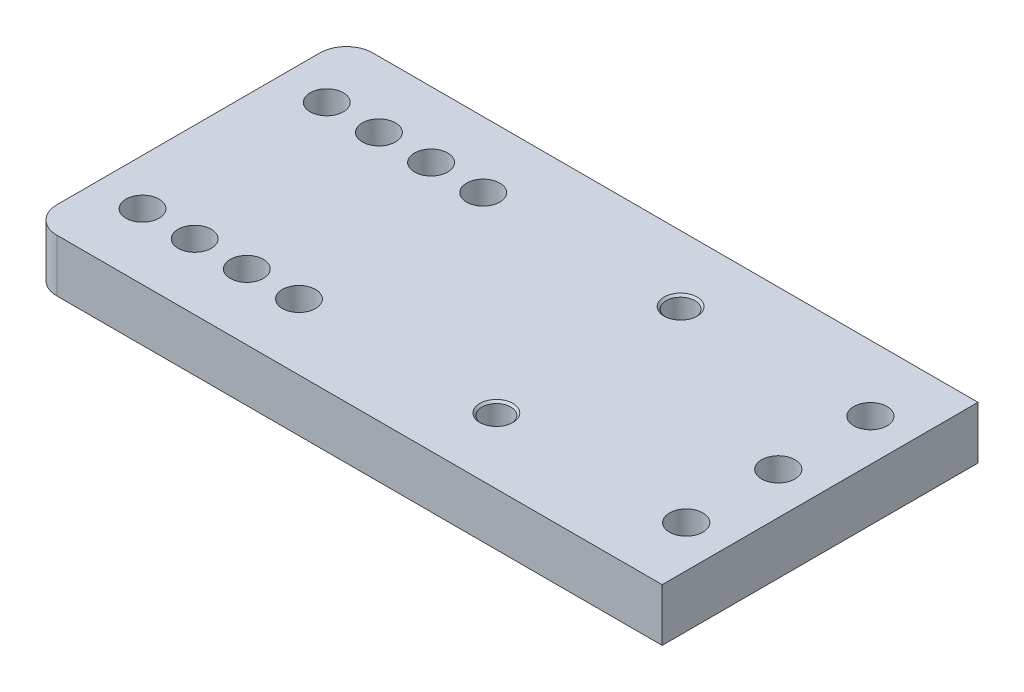
ISO-10303-21;
HEADER;
FILE_DESCRIPTION(('STEP AP214'),'2;1');
FILE_NAME('part.step','',(''),(''),'','','');
FILE_SCHEMA(('AUTOMOTIVE_DESIGN { 1 0 10303 214 1 1 1 1 }'));
ENDSEC;
DATA;
#1=APPLICATION_CONTEXT('core data for automotive mechanical design processes');
#2=APPLICATION_PROTOCOL_DEFINITION('international standard','automotive_design',2000,#1);
#3=PRODUCT_CONTEXT('',#1,'mechanical');
#4=PRODUCT('Part','Part','',(#3));
#5=PRODUCT_RELATED_PRODUCT_CATEGORY('part','',(#4));
#6=PRODUCT_DEFINITION_FORMATION('','',#4);
#7=PRODUCT_DEFINITION_CONTEXT('part definition',#1,'design');
#8=PRODUCT_DEFINITION('design','',#6,#7);
#9=PRODUCT_DEFINITION_SHAPE('','',#8);
#10=(LENGTH_UNIT() NAMED_UNIT(*) SI_UNIT(.MILLI.,.METRE.));
#11=(NAMED_UNIT(*) PLANE_ANGLE_UNIT() SI_UNIT($,.RADIAN.));
#12=(NAMED_UNIT(*) SI_UNIT($,.STERADIAN.) SOLID_ANGLE_UNIT());
#13=UNCERTAINTY_MEASURE_WITH_UNIT(LENGTH_MEASURE(1.E-05),#10,'distance_accuracy_value','');
#14=(GEOMETRIC_REPRESENTATION_CONTEXT(3) GLOBAL_UNCERTAINTY_ASSIGNED_CONTEXT((#13)) GLOBAL_UNIT_ASSIGNED_CONTEXT((#10,
#11,#12)) REPRESENTATION_CONTEXT('',''));
#15=CARTESIAN_POINT('',(0.,0.,0.));
#16=DIRECTION('',(0.,0.,1.));
#17=DIRECTION('',(1.,0.,0.));
#18=AXIS2_PLACEMENT_3D('',#15,#16,#17);
#19=CARTESIAN_POINT('',(150.,0.,60.));
#20=DIRECTION('',(0.,0.,-1.));
#21=DIRECTION('',(-1.,0.,0.));
#22=AXIS2_PLACEMENT_3D('',#19,#20,#21);
#23=PLANE('',#22);
#24=DIRECTION('',(0.,-1.,0.));
#25=VECTOR('',#24,1.);
#26=CARTESIAN_POINT('',(120.,0.,60.));
#27=LINE('',#26,#25);
#28=CARTESIAN_POINT('',(120.,10.,60.));
#29=VERTEX_POINT('',#28);
#30=CARTESIAN_POINT('',(120.,0.,60.));
#31=VERTEX_POINT('',#30);
#32=EDGE_CURVE('E278',#29,#31,#27,.T.);
#33=ORIENTED_EDGE('',*,*,#32,.F.);
#34=DIRECTION('',(-1.,0.,0.));
#35=VECTOR('',#34,1.);
#36=CARTESIAN_POINT('',(150.,10.,60.));
#37=LINE('',#36,#35);
#38=CARTESIAN_POINT('',(5.,10.,60.));
#39=VERTEX_POINT('',#38);
#40=EDGE_CURVE('E110',#39,#29,#37,.F.);
#41=ORIENTED_EDGE('',*,*,#40,.F.);
#42=DIRECTION('',(0.,1.,0.));
#43=VECTOR('',#42,1.);
#44=CARTESIAN_POINT('',(5.,0.,60.));
#45=LINE('',#44,#43);
#46=CARTESIAN_POINT('',(5.,0.,60.));
#47=VERTEX_POINT('',#46);
#48=EDGE_CURVE('E174',#47,#39,#45,.T.);
#49=ORIENTED_EDGE('',*,*,#48,.F.);
#50=DIRECTION('',(-1.,0.,0.));
#51=VECTOR('',#50,1.);
#52=CARTESIAN_POINT('',(150.,0.,60.));
#53=LINE('',#52,#51);
#54=EDGE_CURVE('E113',#31,#47,#53,.T.);
#55=ORIENTED_EDGE('',*,*,#54,.F.);
#56=EDGE_LOOP('',(#33,#41,#49,#55));
#57=FACE_BOUND('',#56,.T.);
#58=ADVANCED_FACE('F41',(#57),#23,.F.);
#59=CARTESIAN_POINT('',(150.,0.,0.));
#60=DIRECTION('',(0.,0.,-1.));
#61=DIRECTION('',(-1.,0.,0.));
#62=AXIS2_PLACEMENT_3D('',#59,#60,#61);
#63=PLANE('',#62);
#64=DIRECTION('',(-1.,0.,0.));
#65=VECTOR('',#64,1.);
#66=CARTESIAN_POINT('',(150.,10.,0.));
#67=LINE('',#66,#65);
#68=CARTESIAN_POINT('',(5.,10.,0.));
#69=VERTEX_POINT('',#68);
#70=CARTESIAN_POINT('',(120.,10.,0.));
#71=VERTEX_POINT('',#70);
#72=EDGE_CURVE('E50',#69,#71,#67,.F.);
#73=ORIENTED_EDGE('',*,*,#72,.T.);
#74=DIRECTION('',(0.,-1.,0.));
#75=VECTOR('',#74,1.);
#76=CARTESIAN_POINT('',(120.,0.,0.));
#77=LINE('',#76,#75);
#78=CARTESIAN_POINT('',(120.,0.,0.));
#79=VERTEX_POINT('',#78);
#80=EDGE_CURVE('E12',#71,#79,#77,.T.);
#81=ORIENTED_EDGE('',*,*,#80,.T.);
#82=DIRECTION('',(-1.,0.,0.));
#83=VECTOR('',#82,1.);
#84=CARTESIAN_POINT('',(150.,0.,0.));
#85=LINE('',#84,#83);
#86=CARTESIAN_POINT('',(5.,0.,0.));
#87=VERTEX_POINT('',#86);
#88=EDGE_CURVE('E124',#79,#87,#85,.T.);
#89=ORIENTED_EDGE('',*,*,#88,.T.);
#90=DIRECTION('',(0.,1.,0.));
#91=VECTOR('',#90,1.);
#92=CARTESIAN_POINT('',(5.,0.,0.));
#93=LINE('',#92,#91);
#94=EDGE_CURVE('E58',#87,#69,#93,.T.);
#95=ORIENTED_EDGE('',*,*,#94,.T.);
#96=EDGE_LOOP('',(#73,#81,#89,#95));
#97=FACE_BOUND('',#96,.T.);
#98=ADVANCED_FACE('F102',(#97),#63,.T.);
#99=CARTESIAN_POINT('',(76.,10.,12.5));
#100=DIRECTION('',(0.,-1.,0.));
#101=DIRECTION('',(0.,0.,-1.));
#102=AXIS2_PLACEMENT_3D('',#99,#100,#101);
#103=CYLINDRICAL_SURFACE('',#102,2.75);
#104=CARTESIAN_POINT('',(76.,9.59999999963657,12.5));
#105=DIRECTION('',(0.,1.,0.));
#106=DIRECTION('',(0.,0.,1.));
#107=AXIS2_PLACEMENT_3D('',#104,#105,#106);
#108=CIRCLE('',#107,2.75000000032151);
#109=CARTESIAN_POINT('',(76.,9.59999999963657,15.2500000003215));
#110=VERTEX_POINT('',#109);
#111=EDGE_CURVE('E187',#110,#110,#108,.T.);
#112=ORIENTED_EDGE('',*,*,#111,.T.);
#113=EDGE_LOOP('',(#112));
#114=FACE_BOUND('',#113,.T.);
#115=CARTESIAN_POINT('',(76.,0.400000000411183,12.5));
#116=DIRECTION('',(0.,-1.,0.));
#117=DIRECTION('',(0.,0.,-1.));
#118=AXIS2_PLACEMENT_3D('',#115,#116,#117);
#119=CIRCLE('',#118,2.75000000040109);
#120=CARTESIAN_POINT('',(76.,0.400000000411183,9.74999999959891));
#121=VERTEX_POINT('',#120);
#122=EDGE_CURVE('E200',#121,#121,#119,.T.);
#123=ORIENTED_EDGE('',*,*,#122,.T.);
#124=EDGE_LOOP('',(#123));
#125=FACE_BOUND('',#124,.T.);
#126=ADVANCED_FACE('F43',(#114,#125),#103,.F.);
#127=CARTESIAN_POINT('',(76.,10.,47.5));
#128=DIRECTION('',(0.,-1.,0.));
#129=DIRECTION('',(0.,0.,-1.));
#130=AXIS2_PLACEMENT_3D('',#127,#128,#129);
#131=CYLINDRICAL_SURFACE('',#130,2.75);
#132=CARTESIAN_POINT('',(76.,9.59999999957972,47.5));
#133=DIRECTION('',(0.,1.,0.));
#134=DIRECTION('',(0.,0.,1.));
#135=AXIS2_PLACEMENT_3D('',#132,#133,#134);
#136=CIRCLE('',#135,2.75000000034652);
#137=CARTESIAN_POINT('',(76.,9.59999999957972,50.2500000003465));
#138=VERTEX_POINT('',#137);
#139=EDGE_CURVE('E184',#138,#138,#136,.T.);
#140=ORIENTED_EDGE('',*,*,#139,.T.);
#141=EDGE_LOOP('',(#140));
#142=FACE_BOUND('',#141,.T.);
#143=CARTESIAN_POINT('',(76.,0.400000000411183,47.5));
#144=DIRECTION('',(0.,-1.,0.));
#145=DIRECTION('',(0.,0.,-1.));
#146=AXIS2_PLACEMENT_3D('',#143,#144,#145);
#147=CIRCLE('',#146,2.75000000037608);
#148=CARTESIAN_POINT('',(76.,0.400000000411183,44.7499999996239));
#149=VERTEX_POINT('',#148);
#150=EDGE_CURVE('E192',#149,#149,#147,.T.);
#151=ORIENTED_EDGE('',*,*,#150,.T.);
#152=EDGE_LOOP('',(#151));
#153=FACE_BOUND('',#152,.T.);
#154=ADVANCED_FACE('F220',(#142,#153),#131,.F.);
#155=CARTESIAN_POINT('',(76.,1.13686837721616E-10,12.5));
#156=DIRECTION('',(0.,-1.,0.));
#157=DIRECTION('',(0.,0.,-1.));
#158=AXIS2_PLACEMENT_3D('',#155,#156,#157);
#159=CONICAL_SURFACE('',#158,3.14999999995962,0.785398162544797);
#160=CARTESIAN_POINT('',(76.,5.6843418860808E-11,12.5));
#161=DIRECTION('',(0.,-1.,0.));
#162=DIRECTION('',(0.,0.,-1.));
#163=AXIS2_PLACEMENT_3D('',#160,#161,#162);
#164=CIRCLE('',#163,3.15000000001646);
#165=CARTESIAN_POINT('',(76.,5.6843418860808E-11,9.34999999998354));
#166=VERTEX_POINT('',#165);
#167=EDGE_CURVE('E149',#166,#166,#164,.T.);
#168=ORIENTED_EDGE('',*,*,#167,.T.);
#169=EDGE_LOOP('',(#168));
#170=FACE_BOUND('',#169,.T.);
#171=ORIENTED_EDGE('',*,*,#122,.F.);
#172=EDGE_LOOP('',(#171));
#173=FACE_BOUND('',#172,.T.);
#174=ADVANCED_FACE('F339',(#170,#173),#159,.F.);
#175=CARTESIAN_POINT('',(76.,1.13686837721616E-10,47.5));
#176=DIRECTION('',(0.,-1.,0.));
#177=DIRECTION('',(0.,0.,-1.));
#178=AXIS2_PLACEMENT_3D('',#175,#176,#177);
#179=CONICAL_SURFACE('',#178,3.14999999993461,0.785398162544797);
#180=CARTESIAN_POINT('',(76.,5.6843418860808E-11,47.5));
#181=DIRECTION('',(0.,-1.,0.));
#182=DIRECTION('',(0.,0.,-1.));
#183=AXIS2_PLACEMENT_3D('',#180,#181,#182);
#184=CIRCLE('',#183,3.14999999999145);
#185=CARTESIAN_POINT('',(76.,5.6843418860808E-11,44.3500000000085));
#186=VERTEX_POINT('',#185);
#187=EDGE_CURVE('E145',#186,#186,#184,.T.);
#188=ORIENTED_EDGE('',*,*,#187,.T.);
#189=EDGE_LOOP('',(#188));
#190=FACE_BOUND('',#189,.T.);
#191=ORIENTED_EDGE('',*,*,#150,.F.);
#192=EDGE_LOOP('',(#191));
#193=FACE_BOUND('',#192,.T.);
#194=ADVANCED_FACE('F214',(#190,#193),#179,.F.);
#195=CARTESIAN_POINT('',(76.,9.99999999993406,12.5));
#196=DIRECTION('',(0.,1.,0.));
#197=DIRECTION('',(0.,0.,1.));
#198=AXIS2_PLACEMENT_3D('',#195,#196,#197);
#199=CONICAL_SURFACE('',#198,3.14999999988004,0.785398162473743);
#200=CARTESIAN_POINT('',(76.,9.99999999999091,12.5));
#201=DIRECTION('',(0.,1.,0.));
#202=DIRECTION('',(0.,0.,1.));
#203=AXIS2_PLACEMENT_3D('',#200,#201,#202);
#204=CIRCLE('',#203,3.14999999993688);
#205=CARTESIAN_POINT('',(76.,9.99999999999091,15.6499999999369));
#206=VERTEX_POINT('',#205);
#207=EDGE_CURVE('E142',#206,#206,#204,.F.);
#208=ORIENTED_EDGE('',*,*,#207,.F.);
#209=EDGE_LOOP('',(#208));
#210=FACE_BOUND('',#209,.T.);
#211=ORIENTED_EDGE('',*,*,#111,.F.);
#212=EDGE_LOOP('',(#211));
#213=FACE_BOUND('',#212,.T.);
#214=ADVANCED_FACE('F210',(#210,#213),#199,.F.);
#215=CARTESIAN_POINT('',(76.,9.99999999987722,47.5));
#216=DIRECTION('',(0.,1.,0.));
#217=DIRECTION('',(0.,0.,1.));
#218=AXIS2_PLACEMENT_3D('',#215,#216,#217);
#219=CONICAL_SURFACE('',#218,3.14999999990505,0.785398162473743);
#220=CARTESIAN_POINT('',(76.,9.99999999993406,47.5));
#221=DIRECTION('',(0.,1.,0.));
#222=DIRECTION('',(0.,0.,1.));
#223=AXIS2_PLACEMENT_3D('',#220,#221,#222);
#224=CIRCLE('',#223,3.14999999996189);
#225=CARTESIAN_POINT('',(76.,9.99999999993406,50.6499999999619));
#226=VERTEX_POINT('',#225);
#227=EDGE_CURVE('E121',#226,#226,#224,.F.);
#228=ORIENTED_EDGE('',*,*,#227,.F.);
#229=EDGE_LOOP('',(#228));
#230=FACE_BOUND('',#229,.T.);
#231=ORIENTED_EDGE('',*,*,#139,.F.);
#232=EDGE_LOOP('',(#231));
#233=FACE_BOUND('',#232,.T.);
#234=ADVANCED_FACE('F213',(#230,#233),#219,.F.);
#235=CARTESIAN_POINT('',(0.,0.,0.));
#236=DIRECTION('',(-1.,0.,0.));
#237=DIRECTION('',(0.,0.,1.));
#238=AXIS2_PLACEMENT_3D('',#235,#236,#237);
#239=PLANE('',#238);
#240=DIRECTION('',(0.,0.,1.));
#241=VECTOR('',#240,1.);
#242=CARTESIAN_POINT('',(0.,10.,0.));
#243=LINE('',#242,#241);
#244=CARTESIAN_POINT('',(0.,10.,5.));
#245=VERTEX_POINT('',#244);
#246=CARTESIAN_POINT('',(0.,10.,55.));
#247=VERTEX_POINT('',#246);
#248=EDGE_CURVE('E119',#245,#247,#243,.T.);
#249=ORIENTED_EDGE('',*,*,#248,.F.);
#250=DIRECTION('',(0.,1.,0.));
#251=VECTOR('',#250,1.);
#252=CARTESIAN_POINT('',(0.,0.,5.));
#253=LINE('',#252,#251);
#254=CARTESIAN_POINT('',(0.,0.,5.));
#255=VERTEX_POINT('',#254);
#256=EDGE_CURVE('E140',#255,#245,#253,.T.);
#257=ORIENTED_EDGE('',*,*,#256,.F.);
#258=DIRECTION('',(0.,0.,1.));
#259=VECTOR('',#258,1.);
#260=CARTESIAN_POINT('',(0.,0.,0.));
#261=LINE('',#260,#259);
#262=CARTESIAN_POINT('',(0.,0.,55.));
#263=VERTEX_POINT('',#262);
#264=EDGE_CURVE('E125',#255,#263,#261,.T.);
#265=ORIENTED_EDGE('',*,*,#264,.T.);
#266=DIRECTION('',(0.,-1.,0.));
#267=VECTOR('',#266,1.);
#268=CARTESIAN_POINT('',(0.,0.,55.));
#269=LINE('',#268,#267);
#270=EDGE_CURVE('E83',#247,#263,#269,.T.);
#271=ORIENTED_EDGE('',*,*,#270,.F.);
#272=EDGE_LOOP('',(#249,#257,#265,#271));
#273=FACE_BOUND('',#272,.T.);
#274=ADVANCED_FACE('F365',(#273),#239,.T.);
#275=CARTESIAN_POINT('',(5.,0.,55.));
#276=DIRECTION('',(0.,-1.,0.));
#277=DIRECTION('',(0.,0.,-1.));
#278=AXIS2_PLACEMENT_3D('',#275,#276,#277);
#279=CYLINDRICAL_SURFACE('',#278,5.);
#280=CARTESIAN_POINT('',(5.,10.,55.));
#281=DIRECTION('',(0.,-1.,0.));
#282=DIRECTION('',(0.,0.,-1.));
#283=AXIS2_PLACEMENT_3D('',#280,#281,#282);
#284=CIRCLE('',#283,5.);
#285=EDGE_CURVE('E115',#247,#39,#284,.F.);
#286=ORIENTED_EDGE('',*,*,#285,.F.);
#287=ORIENTED_EDGE('',*,*,#270,.T.);
#288=CARTESIAN_POINT('',(5.,0.,55.));
#289=DIRECTION('',(0.,-1.,0.));
#290=DIRECTION('',(0.,0.,-1.));
#291=AXIS2_PLACEMENT_3D('',#288,#289,#290);
#292=CIRCLE('',#291,5.);
#293=EDGE_CURVE('E141',#263,#47,#292,.F.);
#294=ORIENTED_EDGE('',*,*,#293,.T.);
#295=ORIENTED_EDGE('',*,*,#48,.T.);
#296=EDGE_LOOP('',(#286,#287,#294,#295));
#297=FACE_BOUND('',#296,.T.);
#298=ADVANCED_FACE('F312',(#297),#279,.T.);
#299=CARTESIAN_POINT('',(150.,0.,0.));
#300=DIRECTION('',(0.,1.,0.));
#301=DIRECTION('',(0.,0.,1.));
#302=AXIS2_PLACEMENT_3D('',#299,#300,#301);
#303=PLANE('',#302);
#304=CARTESIAN_POINT('',(112.0625,0.,47.5));
#305=DIRECTION('',(0.,-1.,0.));
#306=DIRECTION('',(0.,0.,-1.));
#307=AXIS2_PLACEMENT_3D('',#304,#305,#306);
#308=CIRCLE('',#307,3.175);
#309=CARTESIAN_POINT('',(112.0625,0.,44.325));
#310=VERTEX_POINT('',#309);
#311=EDGE_CURVE('E293',#310,#310,#308,.T.);
#312=ORIENTED_EDGE('',*,*,#311,.F.);
#313=EDGE_LOOP('',(#312));
#314=FACE_BOUND('',#313,.T.);
#315=CARTESIAN_POINT('',(112.0625,0.,30.));
#316=DIRECTION('',(0.,-1.,0.));
#317=DIRECTION('',(0.,0.,-1.));
#318=AXIS2_PLACEMENT_3D('',#315,#316,#317);
#319=CIRCLE('',#318,3.175);
#320=CARTESIAN_POINT('',(112.0625,0.,26.825));
#321=VERTEX_POINT('',#320);
#322=EDGE_CURVE('E287',#321,#321,#319,.T.);
#323=ORIENTED_EDGE('',*,*,#322,.F.);
#324=EDGE_LOOP('',(#323));
#325=FACE_BOUND('',#324,.T.);
#326=CARTESIAN_POINT('',(112.0625,0.,12.5));
#327=DIRECTION('',(0.,-1.,0.));
#328=DIRECTION('',(0.,0.,-1.));
#329=AXIS2_PLACEMENT_3D('',#326,#327,#328);
#330=CIRCLE('',#329,3.175);
#331=CARTESIAN_POINT('',(112.0625,0.,9.325));
#332=VERTEX_POINT('',#331);
#333=EDGE_CURVE('E281',#332,#332,#330,.T.);
#334=ORIENTED_EDGE('',*,*,#333,.F.);
#335=EDGE_LOOP('',(#334));
#336=FACE_BOUND('',#335,.T.);
#337=CARTESIAN_POINT('',(38.5,0.,47.4999999999997));
#338=DIRECTION('',(0.,-1.,0.));
#339=DIRECTION('',(0.,0.,-1.));
#340=AXIS2_PLACEMENT_3D('',#337,#338,#339);
#341=CIRCLE('',#340,3.14999999999145);
#342=CARTESIAN_POINT('',(38.5,0.,44.3500000000083));
#343=VERTEX_POINT('',#342);
#344=EDGE_CURVE('E264',#343,#343,#341,.T.);
#345=ORIENTED_EDGE('',*,*,#344,.F.);
#346=EDGE_LOOP('',(#345));
#347=FACE_BOUND('',#346,.T.);
#348=CARTESIAN_POINT('',(18.688,0.,12.4999999999996));
#349=DIRECTION('',(0.,-1.,0.));
#350=DIRECTION('',(0.,0.,-1.));
#351=AXIS2_PLACEMENT_3D('',#348,#349,#350);
#352=CIRCLE('',#351,3.15000000001647);
#353=CARTESIAN_POINT('',(18.688,0.,9.34999999998313));
#354=VERTEX_POINT('',#353);
#355=EDGE_CURVE('E262',#354,#354,#352,.T.);
#356=ORIENTED_EDGE('',*,*,#355,.F.);
#357=EDGE_LOOP('',(#356));
#358=FACE_BOUND('',#357,.T.);
#359=CARTESIAN_POINT('',(28.594,0.,47.4999999999997));
#360=DIRECTION('',(0.,-1.,0.));
#361=DIRECTION('',(0.,0.,-1.));
#362=AXIS2_PLACEMENT_3D('',#359,#360,#361);
#363=CIRCLE('',#362,3.14999999999145);
#364=CARTESIAN_POINT('',(28.594,0.,44.3500000000082));
#365=VERTEX_POINT('',#364);
#366=EDGE_CURVE('E258',#365,#365,#363,.T.);
#367=ORIENTED_EDGE('',*,*,#366,.F.);
#368=EDGE_LOOP('',(#367));
#369=FACE_BOUND('',#368,.T.);
#370=CARTESIAN_POINT('',(38.5,0.,12.4999999999997));
#371=DIRECTION('',(0.,-1.,0.));
#372=DIRECTION('',(0.,0.,-1.));
#373=AXIS2_PLACEMENT_3D('',#370,#371,#372);
#374=CIRCLE('',#373,3.15000000001647);
#375=CARTESIAN_POINT('',(38.5,0.,9.34999999998327));
#376=VERTEX_POINT('',#375);
#377=EDGE_CURVE('E254',#376,#376,#374,.T.);
#378=ORIENTED_EDGE('',*,*,#377,.F.);
#379=EDGE_LOOP('',(#378));
#380=FACE_BOUND('',#379,.T.);
#381=CARTESIAN_POINT('',(8.78199999999999,0.,47.4999999999995));
#382=DIRECTION('',(0.,-1.,0.));
#383=DIRECTION('',(0.,0.,-1.));
#384=AXIS2_PLACEMENT_3D('',#381,#382,#383);
#385=CIRCLE('',#384,3.14999999999145);
#386=CARTESIAN_POINT('',(8.78199999999999,0.,44.3500000000081));
#387=VERTEX_POINT('',#386);
#388=EDGE_CURVE('E273',#387,#387,#385,.T.);
#389=ORIENTED_EDGE('',*,*,#388,.F.);
#390=EDGE_LOOP('',(#389));
#391=FACE_BOUND('',#390,.T.);
#392=CARTESIAN_POINT('',(8.782,0.,12.4999999999995));
#393=DIRECTION('',(0.,-1.,0.));
#394=DIRECTION('',(0.,0.,-1.));
#395=AXIS2_PLACEMENT_3D('',#392,#393,#394);
#396=CIRCLE('',#395,3.15000000001647);
#397=CARTESIAN_POINT('',(8.782,0.,9.34999999998306));
#398=VERTEX_POINT('',#397);
#399=EDGE_CURVE('E270',#398,#398,#396,.T.);
#400=ORIENTED_EDGE('',*,*,#399,.F.);
#401=EDGE_LOOP('',(#400));
#402=FACE_BOUND('',#401,.T.);
#403=CARTESIAN_POINT('',(18.688,0.,47.4999999999996));
#404=DIRECTION('',(0.,-1.,0.));
#405=DIRECTION('',(0.,0.,-1.));
#406=AXIS2_PLACEMENT_3D('',#403,#404,#405);
#407=CIRCLE('',#406,3.14999999999145);
#408=CARTESIAN_POINT('',(18.688,0.,44.3500000000081));
#409=VERTEX_POINT('',#408);
#410=EDGE_CURVE('E267',#409,#409,#407,.T.);
#411=ORIENTED_EDGE('',*,*,#410,.F.);
#412=EDGE_LOOP('',(#411));
#413=FACE_BOUND('',#412,.T.);
#414=CARTESIAN_POINT('',(28.594,0.,12.4999999999997));
#415=DIRECTION('',(0.,-1.,0.));
#416=DIRECTION('',(0.,0.,-1.));
#417=AXIS2_PLACEMENT_3D('',#414,#415,#416);
#418=CIRCLE('',#417,3.15000000001647);
#419=CARTESIAN_POINT('',(28.594,0.,9.3499999999832));
#420=VERTEX_POINT('',#419);
#421=EDGE_CURVE('E250',#420,#420,#418,.T.);
#422=ORIENTED_EDGE('',*,*,#421,.F.);
#423=EDGE_LOOP('',(#422));
#424=FACE_BOUND('',#423,.T.);
#425=ORIENTED_EDGE('',*,*,#293,.F.);
#426=ORIENTED_EDGE('',*,*,#264,.F.);
#427=CARTESIAN_POINT('',(5.,0.,5.));
#428=DIRECTION('',(0.,1.,0.));
#429=DIRECTION('',(0.,0.,1.));
#430=AXIS2_PLACEMENT_3D('',#427,#428,#429);
#431=CIRCLE('',#430,5.);
#432=EDGE_CURVE('E135',#87,#255,#431,.T.);
#433=ORIENTED_EDGE('',*,*,#432,.F.);
#434=ORIENTED_EDGE('',*,*,#88,.F.);
#435=DIRECTION('',(0.,0.,1.));
#436=VECTOR('',#435,1.);
#437=CARTESIAN_POINT('',(120.,0.,0.));
#438=LINE('',#437,#436);
#439=EDGE_CURVE('E99',#31,#79,#438,.F.);
#440=ORIENTED_EDGE('',*,*,#439,.F.);
#441=ORIENTED_EDGE('',*,*,#54,.T.);
#442=EDGE_LOOP('',(#425,#426,#433,#434,#440,#441));
#443=FACE_BOUND('',#442,.T.);
#444=ORIENTED_EDGE('',*,*,#187,.F.);
#445=EDGE_LOOP('',(#444));
#446=FACE_BOUND('',#445,.T.);
#447=ORIENTED_EDGE('',*,*,#167,.F.);
#448=EDGE_LOOP('',(#447));
#449=FACE_BOUND('',#448,.T.);
#450=ADVANCED_FACE('F308',(#314,#325,#336,#347,#358,#369,#380,#391,#402,#413,#424,#443,#446,
#449),#303,.F.);
#451=CARTESIAN_POINT('',(5.,0.,5.));
#452=DIRECTION('',(0.,1.,0.));
#453=DIRECTION('',(0.,0.,1.));
#454=AXIS2_PLACEMENT_3D('',#451,#452,#453);
#455=CYLINDRICAL_SURFACE('',#454,5.);
#456=CARTESIAN_POINT('',(5.,10.,5.));
#457=DIRECTION('',(0.,1.,0.));
#458=DIRECTION('',(0.,0.,1.));
#459=AXIS2_PLACEMENT_3D('',#456,#457,#458);
#460=CIRCLE('',#459,5.);
#461=EDGE_CURVE('E111',#69,#245,#460,.T.);
#462=ORIENTED_EDGE('',*,*,#461,.F.);
#463=ORIENTED_EDGE('',*,*,#94,.F.);
#464=ORIENTED_EDGE('',*,*,#432,.T.);
#465=ORIENTED_EDGE('',*,*,#256,.T.);
#466=EDGE_LOOP('',(#462,#463,#464,#465));
#467=FACE_BOUND('',#466,.T.);
#468=ADVANCED_FACE('F311',(#467),#455,.T.);
#469=CARTESIAN_POINT('',(150.,10.,0.));
#470=DIRECTION('',(0.,1.,0.));
#471=DIRECTION('',(0.,0.,1.));
#472=AXIS2_PLACEMENT_3D('',#469,#470,#471);
#473=PLANE('',#472);
#474=CARTESIAN_POINT('',(112.0625,10.,47.5));
#475=DIRECTION('',(0.,-1.,0.));
#476=DIRECTION('',(0.,0.,-1.));
#477=AXIS2_PLACEMENT_3D('',#474,#475,#476);
#478=CIRCLE('',#477,3.175);
#479=CARTESIAN_POINT('',(112.0625,10.,44.325));
#480=VERTEX_POINT('',#479);
#481=EDGE_CURVE('E280',#480,#480,#478,.T.);
#482=ORIENTED_EDGE('',*,*,#481,.T.);
#483=EDGE_LOOP('',(#482));
#484=FACE_BOUND('',#483,.T.);
#485=CARTESIAN_POINT('',(112.0625,10.,30.));
#486=DIRECTION('',(0.,-1.,0.));
#487=DIRECTION('',(0.,0.,-1.));
#488=AXIS2_PLACEMENT_3D('',#485,#486,#487);
#489=CIRCLE('',#488,3.175);
#490=CARTESIAN_POINT('',(112.0625,10.,26.825));
#491=VERTEX_POINT('',#490);
#492=EDGE_CURVE('E290',#491,#491,#489,.T.);
#493=ORIENTED_EDGE('',*,*,#492,.T.);
#494=EDGE_LOOP('',(#493));
#495=FACE_BOUND('',#494,.T.);
#496=CARTESIAN_POINT('',(112.0625,10.,12.5));
#497=DIRECTION('',(0.,-1.,0.));
#498=DIRECTION('',(0.,0.,-1.));
#499=AXIS2_PLACEMENT_3D('',#496,#497,#498);
#500=CIRCLE('',#499,3.175);
#501=CARTESIAN_POINT('',(112.0625,10.,9.325));
#502=VERTEX_POINT('',#501);
#503=EDGE_CURVE('E284',#502,#502,#500,.T.);
#504=ORIENTED_EDGE('',*,*,#503,.T.);
#505=EDGE_LOOP('',(#504));
#506=FACE_BOUND('',#505,.T.);
#507=CARTESIAN_POINT('',(38.5,10.,47.4999999999997));
#508=DIRECTION('',(0.,1.,0.));
#509=DIRECTION('',(0.,0.,1.));
#510=AXIS2_PLACEMENT_3D('',#507,#508,#509);
#511=CIRCLE('',#510,3.14999999999145);
#512=CARTESIAN_POINT('',(38.5,10.,50.6499999999912));
#513=VERTEX_POINT('',#512);
#514=EDGE_CURVE('E225',#513,#513,#511,.T.);
#515=ORIENTED_EDGE('',*,*,#514,.F.);
#516=EDGE_LOOP('',(#515));
#517=FACE_BOUND('',#516,.T.);
#518=CARTESIAN_POINT('',(18.688,10.,12.4999999999996));
#519=DIRECTION('',(0.,1.,0.));
#520=DIRECTION('',(0.,0.,1.));
#521=AXIS2_PLACEMENT_3D('',#518,#519,#520);
#522=CIRCLE('',#521,3.15000000001647);
#523=CARTESIAN_POINT('',(18.688,10.,15.6500000000161));
#524=VERTEX_POINT('',#523);
#525=EDGE_CURVE('E228',#524,#524,#522,.T.);
#526=ORIENTED_EDGE('',*,*,#525,.F.);
#527=EDGE_LOOP('',(#526));
#528=FACE_BOUND('',#527,.T.);
#529=CARTESIAN_POINT('',(28.594,10.,47.4999999999997));
#530=DIRECTION('',(0.,1.,0.));
#531=DIRECTION('',(0.,0.,1.));
#532=AXIS2_PLACEMENT_3D('',#529,#530,#531);
#533=CIRCLE('',#532,3.14999999999145);
#534=CARTESIAN_POINT('',(28.594,10.,50.6499999999911));
#535=VERTEX_POINT('',#534);
#536=EDGE_CURVE('E232',#535,#535,#533,.T.);
#537=ORIENTED_EDGE('',*,*,#536,.F.);
#538=EDGE_LOOP('',(#537));
#539=FACE_BOUND('',#538,.T.);
#540=CARTESIAN_POINT('',(38.5,10.,12.4999999999997));
#541=DIRECTION('',(0.,1.,0.));
#542=DIRECTION('',(0.,0.,1.));
#543=AXIS2_PLACEMENT_3D('',#540,#541,#542);
#544=CIRCLE('',#543,3.15000000001647);
#545=CARTESIAN_POINT('',(38.5,10.,15.6500000000162));
#546=VERTEX_POINT('',#545);
#547=EDGE_CURVE('E237',#546,#546,#544,.T.);
#548=ORIENTED_EDGE('',*,*,#547,.F.);
#549=EDGE_LOOP('',(#548));
#550=FACE_BOUND('',#549,.T.);
#551=CARTESIAN_POINT('',(8.78199999999999,10.,47.4999999999995));
#552=DIRECTION('',(0.,1.,0.));
#553=DIRECTION('',(0.,0.,1.));
#554=AXIS2_PLACEMENT_3D('',#551,#552,#553);
#555=CIRCLE('',#554,3.14999999999145);
#556=CARTESIAN_POINT('',(8.78199999999999,10.,50.649999999991));
#557=VERTEX_POINT('',#556);
#558=EDGE_CURVE('E240',#557,#557,#555,.T.);
#559=ORIENTED_EDGE('',*,*,#558,.F.);
#560=EDGE_LOOP('',(#559));
#561=FACE_BOUND('',#560,.T.);
#562=CARTESIAN_POINT('',(8.782,10.,12.4999999999995));
#563=DIRECTION('',(0.,1.,0.));
#564=DIRECTION('',(0.,0.,1.));
#565=AXIS2_PLACEMENT_3D('',#562,#563,#564);
#566=CIRCLE('',#565,3.15000000001647);
#567=CARTESIAN_POINT('',(8.782,10.,15.650000000016));
#568=VERTEX_POINT('',#567);
#569=EDGE_CURVE('E243',#568,#568,#566,.T.);
#570=ORIENTED_EDGE('',*,*,#569,.F.);
#571=EDGE_LOOP('',(#570));
#572=FACE_BOUND('',#571,.T.);
#573=CARTESIAN_POINT('',(18.688,10.,47.4999999999996));
#574=DIRECTION('',(0.,1.,0.));
#575=DIRECTION('',(0.,0.,1.));
#576=AXIS2_PLACEMENT_3D('',#573,#574,#575);
#577=CIRCLE('',#576,3.14999999999145);
#578=CARTESIAN_POINT('',(18.688,10.,50.6499999999911));
#579=VERTEX_POINT('',#578);
#580=EDGE_CURVE('E246',#579,#579,#577,.T.);
#581=ORIENTED_EDGE('',*,*,#580,.F.);
#582=EDGE_LOOP('',(#581));
#583=FACE_BOUND('',#582,.T.);
#584=CARTESIAN_POINT('',(28.594,10.,12.4999999999997));
#585=DIRECTION('',(0.,1.,0.));
#586=DIRECTION('',(0.,0.,1.));
#587=AXIS2_PLACEMENT_3D('',#584,#585,#586);
#588=CIRCLE('',#587,3.15000000001647);
#589=CARTESIAN_POINT('',(28.594,10.,15.6500000000161));
#590=VERTEX_POINT('',#589);
#591=EDGE_CURVE('E248',#590,#590,#588,.T.);
#592=ORIENTED_EDGE('',*,*,#591,.F.);
#593=EDGE_LOOP('',(#592));
#594=FACE_BOUND('',#593,.T.);
#595=ORIENTED_EDGE('',*,*,#72,.F.);
#596=ORIENTED_EDGE('',*,*,#461,.T.);
#597=ORIENTED_EDGE('',*,*,#248,.T.);
#598=ORIENTED_EDGE('',*,*,#285,.T.);
#599=ORIENTED_EDGE('',*,*,#40,.T.);
#600=DIRECTION('',(0.,0.,1.));
#601=VECTOR('',#600,1.);
#602=CARTESIAN_POINT('',(120.,10.,0.));
#603=LINE('',#602,#601);
#604=EDGE_CURVE('E91',#29,#71,#603,.F.);
#605=ORIENTED_EDGE('',*,*,#604,.T.);
#606=EDGE_LOOP('',(#595,#596,#597,#598,#599,#605));
#607=FACE_BOUND('',#606,.T.);
#608=ORIENTED_EDGE('',*,*,#227,.T.);
#609=EDGE_LOOP('',(#608));
#610=FACE_BOUND('',#609,.T.);
#611=ORIENTED_EDGE('',*,*,#207,.T.);
#612=EDGE_LOOP('',(#611));
#613=FACE_BOUND('',#612,.T.);
#614=ADVANCED_FACE('F107',(#484,#495,#506,#517,#528,#539,#550,#561,#572,#583,#594,#607,#610,
#613),#473,.T.);
#615=CARTESIAN_POINT('',(28.594,200.,12.4999999999997));
#616=DIRECTION('',(0.,-1.,0.));
#617=DIRECTION('',(0.,0.,-1.));
#618=AXIS2_PLACEMENT_3D('',#615,#616,#617);
#619=CYLINDRICAL_SURFACE('',#618,3.15000000001647);
#620=ORIENTED_EDGE('',*,*,#591,.T.);
#621=EDGE_LOOP('',(#620));
#622=FACE_BOUND('',#621,.T.);
#623=ORIENTED_EDGE('',*,*,#421,.T.);
#624=EDGE_LOOP('',(#623));
#625=FACE_BOUND('',#624,.T.);
#626=ADVANCED_FACE('F221',(#622,#625),#619,.F.);
#627=CARTESIAN_POINT('',(18.688,200.,47.4999999999996));
#628=DIRECTION('',(0.,-1.,0.));
#629=DIRECTION('',(0.,0.,-1.));
#630=AXIS2_PLACEMENT_3D('',#627,#628,#629);
#631=CYLINDRICAL_SURFACE('',#630,3.14999999999145);
#632=ORIENTED_EDGE('',*,*,#580,.T.);
#633=EDGE_LOOP('',(#632));
#634=FACE_BOUND('',#633,.T.);
#635=ORIENTED_EDGE('',*,*,#410,.T.);
#636=EDGE_LOOP('',(#635));
#637=FACE_BOUND('',#636,.T.);
#638=ADVANCED_FACE('F408',(#634,#637),#631,.F.);
#639=CARTESIAN_POINT('',(8.782,200.,12.4999999999995));
#640=DIRECTION('',(0.,-1.,0.));
#641=DIRECTION('',(0.,0.,-1.));
#642=AXIS2_PLACEMENT_3D('',#639,#640,#641);
#643=CYLINDRICAL_SURFACE('',#642,3.15000000001647);
#644=ORIENTED_EDGE('',*,*,#569,.T.);
#645=EDGE_LOOP('',(#644));
#646=FACE_BOUND('',#645,.T.);
#647=ORIENTED_EDGE('',*,*,#399,.T.);
#648=EDGE_LOOP('',(#647));
#649=FACE_BOUND('',#648,.T.);
#650=ADVANCED_FACE('F415',(#646,#649),#643,.F.);
#651=CARTESIAN_POINT('',(8.78199999999999,200.,47.4999999999995));
#652=DIRECTION('',(0.,-1.,0.));
#653=DIRECTION('',(0.,0.,-1.));
#654=AXIS2_PLACEMENT_3D('',#651,#652,#653);
#655=CYLINDRICAL_SURFACE('',#654,3.14999999999145);
#656=ORIENTED_EDGE('',*,*,#558,.T.);
#657=EDGE_LOOP('',(#656));
#658=FACE_BOUND('',#657,.T.);
#659=ORIENTED_EDGE('',*,*,#388,.T.);
#660=EDGE_LOOP('',(#659));
#661=FACE_BOUND('',#660,.T.);
#662=ADVANCED_FACE('F423',(#658,#661),#655,.F.);
#663=CARTESIAN_POINT('',(38.5,200.,12.4999999999997));
#664=DIRECTION('',(0.,-1.,0.));
#665=DIRECTION('',(0.,0.,-1.));
#666=AXIS2_PLACEMENT_3D('',#663,#664,#665);
#667=CYLINDRICAL_SURFACE('',#666,3.15000000001647);
#668=ORIENTED_EDGE('',*,*,#547,.T.);
#669=EDGE_LOOP('',(#668));
#670=FACE_BOUND('',#669,.T.);
#671=ORIENTED_EDGE('',*,*,#377,.T.);
#672=EDGE_LOOP('',(#671));
#673=FACE_BOUND('',#672,.T.);
#674=ADVANCED_FACE('F431',(#670,#673),#667,.F.);
#675=CARTESIAN_POINT('',(28.594,200.,47.4999999999997));
#676=DIRECTION('',(0.,-1.,0.));
#677=DIRECTION('',(0.,0.,-1.));
#678=AXIS2_PLACEMENT_3D('',#675,#676,#677);
#679=CYLINDRICAL_SURFACE('',#678,3.14999999999145);
#680=ORIENTED_EDGE('',*,*,#536,.T.);
#681=EDGE_LOOP('',(#680));
#682=FACE_BOUND('',#681,.T.);
#683=ORIENTED_EDGE('',*,*,#366,.T.);
#684=EDGE_LOOP('',(#683));
#685=FACE_BOUND('',#684,.T.);
#686=ADVANCED_FACE('F439',(#682,#685),#679,.F.);
#687=CARTESIAN_POINT('',(18.688,200.,12.4999999999996));
#688=DIRECTION('',(0.,-1.,0.));
#689=DIRECTION('',(0.,0.,-1.));
#690=AXIS2_PLACEMENT_3D('',#687,#688,#689);
#691=CYLINDRICAL_SURFACE('',#690,3.15000000001647);
#692=ORIENTED_EDGE('',*,*,#525,.T.);
#693=EDGE_LOOP('',(#692));
#694=FACE_BOUND('',#693,.T.);
#695=ORIENTED_EDGE('',*,*,#355,.T.);
#696=EDGE_LOOP('',(#695));
#697=FACE_BOUND('',#696,.T.);
#698=ADVANCED_FACE('F447',(#694,#697),#691,.F.);
#699=CARTESIAN_POINT('',(38.5,200.,47.4999999999997));
#700=DIRECTION('',(0.,-1.,0.));
#701=DIRECTION('',(0.,0.,-1.));
#702=AXIS2_PLACEMENT_3D('',#699,#700,#701);
#703=CYLINDRICAL_SURFACE('',#702,3.14999999999145);
#704=ORIENTED_EDGE('',*,*,#514,.T.);
#705=EDGE_LOOP('',(#704));
#706=FACE_BOUND('',#705,.T.);
#707=ORIENTED_EDGE('',*,*,#344,.T.);
#708=EDGE_LOOP('',(#707));
#709=FACE_BOUND('',#708,.T.);
#710=ADVANCED_FACE('F455',(#706,#709),#703,.F.);
#711=CARTESIAN_POINT('',(120.,0.,0.));
#712=DIRECTION('',(1.,0.,0.));
#713=DIRECTION('',(0.,0.,-1.));
#714=AXIS2_PLACEMENT_3D('',#711,#712,#713);
#715=PLANE('',#714);
#716=ORIENTED_EDGE('',*,*,#32,.T.);
#717=ORIENTED_EDGE('',*,*,#439,.T.);
#718=ORIENTED_EDGE('',*,*,#80,.F.);
#719=ORIENTED_EDGE('',*,*,#604,.F.);
#720=EDGE_LOOP('',(#716,#717,#718,#719));
#721=FACE_BOUND('',#720,.T.);
#722=ADVANCED_FACE('F97',(#721),#715,.T.);
#723=CARTESIAN_POINT('',(112.0625,10.,12.5));
#724=DIRECTION('',(0.,-1.,0.));
#725=DIRECTION('',(0.,0.,-1.));
#726=AXIS2_PLACEMENT_3D('',#723,#724,#725);
#727=CYLINDRICAL_SURFACE('',#726,3.175);
#728=ORIENTED_EDGE('',*,*,#503,.F.);
#729=EDGE_LOOP('',(#728));
#730=FACE_BOUND('',#729,.T.);
#731=ORIENTED_EDGE('',*,*,#333,.T.);
#732=EDGE_LOOP('',(#731));
#733=FACE_BOUND('',#732,.T.);
#734=ADVANCED_FACE('F468',(#730,#733),#727,.F.);
#735=CARTESIAN_POINT('',(112.0625,10.,30.));
#736=DIRECTION('',(0.,-1.,0.));
#737=DIRECTION('',(0.,0.,-1.));
#738=AXIS2_PLACEMENT_3D('',#735,#736,#737);
#739=CYLINDRICAL_SURFACE('',#738,3.175);
#740=ORIENTED_EDGE('',*,*,#492,.F.);
#741=EDGE_LOOP('',(#740));
#742=FACE_BOUND('',#741,.T.);
#743=ORIENTED_EDGE('',*,*,#322,.T.);
#744=EDGE_LOOP('',(#743));
#745=FACE_BOUND('',#744,.T.);
#746=ADVANCED_FACE('F304',(#742,#745),#739,.F.);
#747=CARTESIAN_POINT('',(112.0625,10.,47.5));
#748=DIRECTION('',(0.,-1.,0.));
#749=DIRECTION('',(0.,0.,-1.));
#750=AXIS2_PLACEMENT_3D('',#747,#748,#749);
#751=CYLINDRICAL_SURFACE('',#750,3.175);
#752=ORIENTED_EDGE('',*,*,#481,.F.);
#753=EDGE_LOOP('',(#752));
#754=FACE_BOUND('',#753,.T.);
#755=ORIENTED_EDGE('',*,*,#311,.T.);
#756=EDGE_LOOP('',(#755));
#757=FACE_BOUND('',#756,.T.);
#758=ADVANCED_FACE('F301',(#754,#757),#751,.F.);
#759=CLOSED_SHELL('',(#58,#98,#126,#154,#174,#194,#214,#234,#274,#298,#450,#468,#614,#626,#638,
#650,#662,#674,#686,#698,#710,#722,#734,#746,#758));
#760=MANIFOLD_SOLID_BREP('B2',#759);
#761=ADVANCED_BREP_SHAPE_REPRESENTATION('',(#18,#760),#14);
#762=SHAPE_DEFINITION_REPRESENTATION(#9,#761);
ENDSEC;
END-ISO-10303-21;
